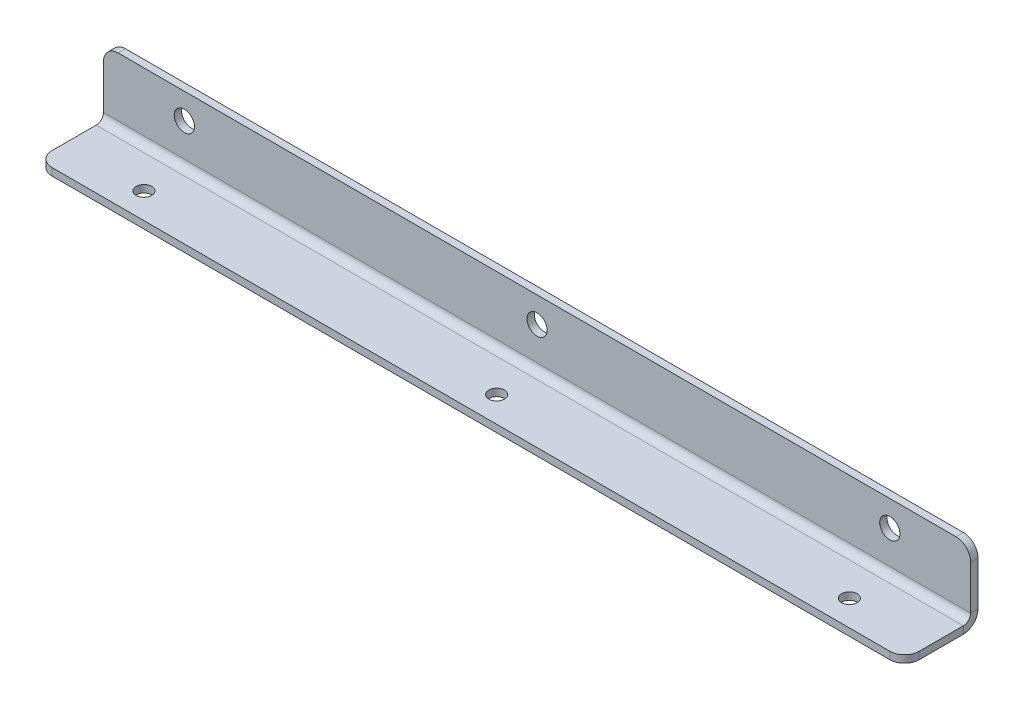
ISO-10303-21;
HEADER;
FILE_DESCRIPTION(('STEP AP214'),'2;1');
FILE_NAME('part.step','',(''),(''),'','','');
FILE_SCHEMA(('AUTOMOTIVE_DESIGN { 1 0 10303 214 1 1 1 1 }'));
ENDSEC;
DATA;
#1=APPLICATION_CONTEXT('core data for automotive mechanical design processes');
#2=APPLICATION_PROTOCOL_DEFINITION('international standard','automotive_design',2000,#1);
#3=PRODUCT_CONTEXT('',#1,'mechanical');
#4=PRODUCT('Part','Part','',(#3));
#5=PRODUCT_RELATED_PRODUCT_CATEGORY('part','',(#4));
#6=PRODUCT_DEFINITION_FORMATION('','',#4);
#7=PRODUCT_DEFINITION_CONTEXT('part definition',#1,'design');
#8=PRODUCT_DEFINITION('design','',#6,#7);
#9=PRODUCT_DEFINITION_SHAPE('','',#8);
#10=(LENGTH_UNIT() NAMED_UNIT(*) SI_UNIT(.MILLI.,.METRE.));
#11=(NAMED_UNIT(*) PLANE_ANGLE_UNIT() SI_UNIT($,.RADIAN.));
#12=(NAMED_UNIT(*) SI_UNIT($,.STERADIAN.) SOLID_ANGLE_UNIT());
#13=UNCERTAINTY_MEASURE_WITH_UNIT(LENGTH_MEASURE(1.E-05),#10,'distance_accuracy_value','');
#14=(GEOMETRIC_REPRESENTATION_CONTEXT(3) GLOBAL_UNCERTAINTY_ASSIGNED_CONTEXT((#13)) GLOBAL_UNIT_ASSIGNED_CONTEXT((#10,
#11,#12)) REPRESENTATION_CONTEXT('',''));
#15=CARTESIAN_POINT('',(0.,0.,0.));
#16=DIRECTION('',(0.,0.,1.));
#17=DIRECTION('',(1.,0.,0.));
#18=AXIS2_PLACEMENT_3D('',#15,#16,#17);
#19=CARTESIAN_POINT('',(374.65,0.,-25.4));
#20=DIRECTION('',(1.,0.,0.));
#21=DIRECTION('',(0.,0.,-1.));
#22=AXIS2_PLACEMENT_3D('',#19,#20,#21);
#23=PLANE('',#22);
#24=DIRECTION('',(0.,1.,0.));
#25=VECTOR('',#24,1.);
#26=CARTESIAN_POINT('',(374.65,0.,-25.4));
#27=LINE('',#26,#25);
#28=CARTESIAN_POINT('',(374.65,0.,-25.4));
#29=VERTEX_POINT('',#28);
#30=CARTESIAN_POINT('',(374.65,3.175,-25.4));
#31=VERTEX_POINT('',#30);
#32=EDGE_CURVE('E137',#29,#31,#27,.T.);
#33=ORIENTED_EDGE('',*,*,#32,.F.);
#34=CARTESIAN_POINT('',(374.65,6.35,-25.4));
#35=DIRECTION('',(-1.,0.,0.));
#36=DIRECTION('',(0.,0.,1.));
#37=AXIS2_PLACEMENT_3D('',#34,#35,#36);
#38=CIRCLE('',#37,6.35);
#39=CARTESIAN_POINT('',(374.65,6.35,-31.75));
#40=VERTEX_POINT('',#39);
#41=EDGE_CURVE('E135',#29,#40,#38,.F.);
#42=ORIENTED_EDGE('',*,*,#41,.T.);
#43=DIRECTION('',(0.,0.,-1.));
#44=VECTOR('',#43,1.);
#45=CARTESIAN_POINT('',(374.65,6.35,-28.575));
#46=LINE('',#45,#44);
#47=CARTESIAN_POINT('',(374.65,6.35,-28.575));
#48=VERTEX_POINT('',#47);
#49=EDGE_CURVE('E129',#48,#40,#46,.T.);
#50=ORIENTED_EDGE('',*,*,#49,.F.);
#51=CARTESIAN_POINT('',(374.65,6.35,-25.4));
#52=DIRECTION('',(1.,0.,0.));
#53=DIRECTION('',(0.,0.,-1.));
#54=AXIS2_PLACEMENT_3D('',#51,#52,#53);
#55=CIRCLE('',#54,3.175);
#56=EDGE_CURVE('E133',#31,#48,#55,.T.);
#57=ORIENTED_EDGE('',*,*,#56,.F.);
#58=EDGE_LOOP('',(#33,#42,#50,#57));
#59=FACE_BOUND('',#58,.T.);
#60=ADVANCED_FACE('F36',(#59),#23,.T.);
#61=CARTESIAN_POINT('',(374.65,6.35,-28.575));
#62=DIRECTION('',(1.,0.,0.));
#63=DIRECTION('',(0.,0.,-1.));
#64=AXIS2_PLACEMENT_3D('',#61,#62,#63);
#65=PLANE('',#64);
#66=DIRECTION('',(0.,0.,-1.));
#67=VECTOR('',#66,1.);
#68=CARTESIAN_POINT('',(374.65,3.175,0.));
#69=LINE('',#68,#67);
#70=CARTESIAN_POINT('',(374.65,3.175,-6.35));
#71=VERTEX_POINT('',#70);
#72=EDGE_CURVE('E158',#71,#31,#69,.T.);
#73=ORIENTED_EDGE('',*,*,#72,.F.);
#74=DIRECTION('',(0.,1.,0.));
#75=VECTOR('',#74,1.);
#76=CARTESIAN_POINT('',(374.65,6.35,-6.35));
#77=LINE('',#76,#75);
#78=CARTESIAN_POINT('',(374.65,0.,-6.35));
#79=VERTEX_POINT('',#78);
#80=EDGE_CURVE('E212',#71,#79,#77,.F.);
#81=ORIENTED_EDGE('',*,*,#80,.T.);
#82=DIRECTION('',(0.,0.,-1.));
#83=VECTOR('',#82,1.);
#84=CARTESIAN_POINT('',(374.65,0.,0.));
#85=LINE('',#84,#83);
#86=EDGE_CURVE('E160',#79,#29,#85,.T.);
#87=ORIENTED_EDGE('',*,*,#86,.T.);
#88=ORIENTED_EDGE('',*,*,#32,.T.);
#89=EDGE_LOOP('',(#73,#81,#87,#88));
#90=FACE_BOUND('',#89,.T.);
#91=ADVANCED_FACE('F256',(#90),#65,.T.);
#92=CARTESIAN_POINT('',(0.,6.35,-31.75));
#93=DIRECTION('',(-1.,0.,0.));
#94=DIRECTION('',(0.,0.,1.));
#95=AXIS2_PLACEMENT_3D('',#92,#93,#94);
#96=PLANE('',#95);
#97=DIRECTION('',(0.,0.,1.));
#98=VECTOR('',#97,1.);
#99=CARTESIAN_POINT('',(0.,6.35,-31.75));
#100=LINE('',#99,#98);
#101=CARTESIAN_POINT('',(0.,6.35,-31.75));
#102=VERTEX_POINT('',#101);
#103=CARTESIAN_POINT('',(0.,6.35,-28.575));
#104=VERTEX_POINT('',#103);
#105=EDGE_CURVE('E138',#102,#104,#100,.T.);
#106=ORIENTED_EDGE('',*,*,#105,.F.);
#107=CARTESIAN_POINT('',(0.,6.35,-25.4));
#108=DIRECTION('',(-1.,0.,0.));
#109=DIRECTION('',(0.,0.,1.));
#110=AXIS2_PLACEMENT_3D('',#107,#108,#109);
#111=CIRCLE('',#110,6.35);
#112=CARTESIAN_POINT('',(0.,0.,-25.4));
#113=VERTEX_POINT('',#112);
#114=EDGE_CURVE('E178',#113,#102,#111,.F.);
#115=ORIENTED_EDGE('',*,*,#114,.F.);
#116=DIRECTION('',(0.,-1.,0.));
#117=VECTOR('',#116,1.);
#118=CARTESIAN_POINT('',(0.,3.175,-25.4));
#119=LINE('',#118,#117);
#120=CARTESIAN_POINT('',(0.,3.175,-25.4));
#121=VERTEX_POINT('',#120);
#122=EDGE_CURVE('E197',#121,#113,#119,.T.);
#123=ORIENTED_EDGE('',*,*,#122,.F.);
#124=CARTESIAN_POINT('',(0.,6.35,-25.4));
#125=DIRECTION('',(1.,0.,0.));
#126=DIRECTION('',(0.,0.,-1.));
#127=AXIS2_PLACEMENT_3D('',#124,#125,#126);
#128=CIRCLE('',#127,3.175);
#129=EDGE_CURVE('E172',#121,#104,#128,.T.);
#130=ORIENTED_EDGE('',*,*,#129,.T.);
#131=EDGE_LOOP('',(#106,#115,#123,#130));
#132=FACE_BOUND('',#131,.T.);
#133=ADVANCED_FACE('F246',(#132),#96,.T.);
#134=CARTESIAN_POINT('',(0.,3.175,-25.4));
#135=DIRECTION('',(-1.,0.,0.));
#136=DIRECTION('',(0.,0.,1.));
#137=AXIS2_PLACEMENT_3D('',#134,#135,#136);
#138=PLANE('',#137);
#139=DIRECTION('',(0.,1.,0.));
#140=VECTOR('',#139,1.);
#141=CARTESIAN_POINT('',(0.,0.,-28.575));
#142=LINE('',#141,#140);
#143=CARTESIAN_POINT('',(0.,25.4,-28.575));
#144=VERTEX_POINT('',#143);
#145=EDGE_CURVE('E145',#104,#144,#142,.T.);
#146=ORIENTED_EDGE('',*,*,#145,.T.);
#147=DIRECTION('',(0.,0.,-1.));
#148=VECTOR('',#147,1.);
#149=CARTESIAN_POINT('',(0.,25.4,-25.4));
#150=LINE('',#149,#148);
#151=CARTESIAN_POINT('',(0.,25.4,-31.75));
#152=VERTEX_POINT('',#151);
#153=EDGE_CURVE('E44',#144,#152,#150,.T.);
#154=ORIENTED_EDGE('',*,*,#153,.T.);
#155=DIRECTION('',(0.,1.,0.));
#156=VECTOR('',#155,1.);
#157=CARTESIAN_POINT('',(0.,0.,-31.75));
#158=LINE('',#157,#156);
#159=EDGE_CURVE('E167',#102,#152,#158,.T.);
#160=ORIENTED_EDGE('',*,*,#159,.F.);
#161=ORIENTED_EDGE('',*,*,#105,.T.);
#162=EDGE_LOOP('',(#146,#154,#160,#161));
#163=FACE_BOUND('',#162,.T.);
#164=ADVANCED_FACE('F234',(#163),#138,.T.);
#165=CARTESIAN_POINT('',(374.65,0.,-31.75));
#166=DIRECTION('',(0.,0.,1.));
#167=DIRECTION('',(1.,0.,0.));
#168=AXIS2_PLACEMENT_3D('',#165,#166,#167);
#169=PLANE('',#168);
#170=CARTESIAN_POINT('',(34.925,20.6375,-31.75));
#171=DIRECTION('',(0.,0.,1.));
#172=DIRECTION('',(-1.,0.,0.));
#173=AXIS2_PLACEMENT_3D('',#170,#171,#172);
#174=CIRCLE('',#173,4.3688);
#175=CARTESIAN_POINT('',(30.5562,20.6375,-31.75));
#176=VERTEX_POINT('',#175);
#177=EDGE_CURVE('E351',#176,#176,#174,.T.);
#178=ORIENTED_EDGE('',*,*,#177,.T.);
#179=EDGE_LOOP('',(#178));
#180=FACE_BOUND('',#179,.T.);
#181=CARTESIAN_POINT('',(339.725,20.6375,-31.75));
#182=DIRECTION('',(0.,0.,1.));
#183=DIRECTION('',(1.,0.,0.));
#184=AXIS2_PLACEMENT_3D('',#181,#182,#183);
#185=CIRCLE('',#184,4.36879999999999);
#186=CARTESIAN_POINT('',(344.0938,20.6375,-31.75));
#187=VERTEX_POINT('',#186);
#188=EDGE_CURVE('E346',#187,#187,#185,.T.);
#189=ORIENTED_EDGE('',*,*,#188,.T.);
#190=EDGE_LOOP('',(#189));
#191=FACE_BOUND('',#190,.T.);
#192=CARTESIAN_POINT('',(187.325,20.6375,-31.75));
#193=DIRECTION('',(0.,0.,1.));
#194=DIRECTION('',(1.,0.,0.));
#195=AXIS2_PLACEMENT_3D('',#192,#193,#194);
#196=CIRCLE('',#195,4.36879999999999);
#197=CARTESIAN_POINT('',(191.6938,20.6375,-31.75));
#198=VERTEX_POINT('',#197);
#199=EDGE_CURVE('E361',#198,#198,#196,.T.);
#200=ORIENTED_EDGE('',*,*,#199,.T.);
#201=EDGE_LOOP('',(#200));
#202=FACE_BOUND('',#201,.T.);
#203=DIRECTION('',(-1.,0.,0.));
#204=VECTOR('',#203,1.);
#205=CARTESIAN_POINT('',(374.65,31.75,-31.75));
#206=LINE('',#205,#204);
#207=CARTESIAN_POINT('',(368.3,31.75,-31.75));
#208=VERTEX_POINT('',#207);
#209=CARTESIAN_POINT('',(6.35000000000013,31.75,-31.75));
#210=VERTEX_POINT('',#209);
#211=EDGE_CURVE('E194',#208,#210,#206,.T.);
#212=ORIENTED_EDGE('',*,*,#211,.F.);
#213=CARTESIAN_POINT('',(368.3,25.4,-31.75));
#214=DIRECTION('',(0.,0.,1.));
#215=DIRECTION('',(1.,0.,0.));
#216=AXIS2_PLACEMENT_3D('',#213,#214,#215);
#217=CIRCLE('',#216,6.35);
#218=CARTESIAN_POINT('',(374.65,25.4,-31.75));
#219=VERTEX_POINT('',#218);
#220=EDGE_CURVE('E225',#208,#219,#217,.F.);
#221=ORIENTED_EDGE('',*,*,#220,.T.);
#222=DIRECTION('',(0.,1.,0.));
#223=VECTOR('',#222,1.);
#224=CARTESIAN_POINT('',(374.65,0.,-31.75));
#225=LINE('',#224,#223);
#226=EDGE_CURVE('E153',#40,#219,#225,.T.);
#227=ORIENTED_EDGE('',*,*,#226,.F.);
#228=DIRECTION('',(-1.,0.,0.));
#229=VECTOR('',#228,1.);
#230=CARTESIAN_POINT('',(374.65,6.35,-31.75));
#231=LINE('',#230,#229);
#232=EDGE_CURVE('E166',#40,#102,#231,.T.);
#233=ORIENTED_EDGE('',*,*,#232,.T.);
#234=ORIENTED_EDGE('',*,*,#159,.T.);
#235=CARTESIAN_POINT('',(6.35,25.4,-31.75));
#236=DIRECTION('',(0.,0.,1.));
#237=DIRECTION('',(1.,0.,0.));
#238=AXIS2_PLACEMENT_3D('',#235,#236,#237);
#239=CIRCLE('',#238,6.35);
#240=EDGE_CURVE('E223',#152,#210,#239,.F.);
#241=ORIENTED_EDGE('',*,*,#240,.T.);
#242=EDGE_LOOP('',(#212,#221,#227,#233,#234,#241));
#243=FACE_BOUND('',#242,.T.);
#244=ADVANCED_FACE('F238',(#180,#191,#202,#243),#169,.F.);
#245=CARTESIAN_POINT('',(374.65,31.75,-28.575));
#246=DIRECTION('',(0.,1.,0.));
#247=DIRECTION('',(0.,0.,1.));
#248=AXIS2_PLACEMENT_3D('',#245,#246,#247);
#249=PLANE('',#248);
#250=DIRECTION('',(-1.,0.,0.));
#251=VECTOR('',#250,1.);
#252=CARTESIAN_POINT('',(374.65,31.75,-28.575));
#253=LINE('',#252,#251);
#254=CARTESIAN_POINT('',(368.3,31.75,-28.575));
#255=VERTEX_POINT('',#254);
#256=CARTESIAN_POINT('',(6.35000000000013,31.75,-28.575));
#257=VERTEX_POINT('',#256);
#258=EDGE_CURVE('E149',#255,#257,#253,.T.);
#259=ORIENTED_EDGE('',*,*,#258,.F.);
#260=DIRECTION('',(0.,0.,-1.));
#261=VECTOR('',#260,1.);
#262=CARTESIAN_POINT('',(368.3,31.75,-28.575));
#263=LINE('',#262,#261);
#264=EDGE_CURVE('E220',#255,#208,#263,.T.);
#265=ORIENTED_EDGE('',*,*,#264,.T.);
#266=ORIENTED_EDGE('',*,*,#211,.T.);
#267=DIRECTION('',(0.,0.,-1.));
#268=VECTOR('',#267,1.);
#269=CARTESIAN_POINT('',(6.35000000000002,31.75,-28.575));
#270=LINE('',#269,#268);
#271=EDGE_CURVE('E218',#210,#257,#270,.F.);
#272=ORIENTED_EDGE('',*,*,#271,.T.);
#273=EDGE_LOOP('',(#259,#265,#266,#272));
#274=FACE_BOUND('',#273,.T.);
#275=ADVANCED_FACE('F299',(#274),#249,.T.);
#276=CARTESIAN_POINT('',(374.65,0.,-28.575));
#277=DIRECTION('',(0.,0.,1.));
#278=DIRECTION('',(1.,0.,0.));
#279=AXIS2_PLACEMENT_3D('',#276,#277,#278);
#280=PLANE('',#279);
#281=CARTESIAN_POINT('',(34.925,20.6375,-28.575));
#282=DIRECTION('',(0.,0.,1.));
#283=DIRECTION('',(-1.,0.,0.));
#284=AXIS2_PLACEMENT_3D('',#281,#282,#283);
#285=CIRCLE('',#284,4.3688);
#286=CARTESIAN_POINT('',(30.5562,20.6375,-28.575));
#287=VERTEX_POINT('',#286);
#288=EDGE_CURVE('E356',#287,#287,#285,.T.);
#289=ORIENTED_EDGE('',*,*,#288,.F.);
#290=EDGE_LOOP('',(#289));
#291=FACE_BOUND('',#290,.T.);
#292=CARTESIAN_POINT('',(339.725,20.6375,-28.575));
#293=DIRECTION('',(0.,0.,1.));
#294=DIRECTION('',(1.,0.,0.));
#295=AXIS2_PLACEMENT_3D('',#292,#293,#294);
#296=CIRCLE('',#295,4.36879999999999);
#297=CARTESIAN_POINT('',(344.0938,20.6375,-28.575));
#298=VERTEX_POINT('',#297);
#299=EDGE_CURVE('E349',#298,#298,#296,.T.);
#300=ORIENTED_EDGE('',*,*,#299,.F.);
#301=EDGE_LOOP('',(#300));
#302=FACE_BOUND('',#301,.T.);
#303=CARTESIAN_POINT('',(187.325,20.6375,-28.575));
#304=DIRECTION('',(0.,0.,1.));
#305=DIRECTION('',(1.,0.,0.));
#306=AXIS2_PLACEMENT_3D('',#303,#304,#305);
#307=CIRCLE('',#306,4.36879999999999);
#308=CARTESIAN_POINT('',(191.6938,20.6375,-28.575));
#309=VERTEX_POINT('',#308);
#310=EDGE_CURVE('E353',#309,#309,#307,.T.);
#311=ORIENTED_EDGE('',*,*,#310,.F.);
#312=EDGE_LOOP('',(#311));
#313=FACE_BOUND('',#312,.T.);
#314=DIRECTION('',(0.,1.,0.));
#315=VECTOR('',#314,1.);
#316=CARTESIAN_POINT('',(374.65,0.,-28.575));
#317=LINE('',#316,#315);
#318=CARTESIAN_POINT('',(374.65,25.4,-28.575));
#319=VERTEX_POINT('',#318);
#320=EDGE_CURVE('E143',#48,#319,#317,.T.);
#321=ORIENTED_EDGE('',*,*,#320,.T.);
#322=CARTESIAN_POINT('',(368.3,25.4,-28.575));
#323=DIRECTION('',(0.,0.,1.));
#324=DIRECTION('',(1.,0.,0.));
#325=AXIS2_PLACEMENT_3D('',#322,#323,#324);
#326=CIRCLE('',#325,6.35);
#327=EDGE_CURVE('E229',#319,#255,#326,.T.);
#328=ORIENTED_EDGE('',*,*,#327,.T.);
#329=ORIENTED_EDGE('',*,*,#258,.T.);
#330=CARTESIAN_POINT('',(6.35,25.4,-28.575));
#331=DIRECTION('',(0.,0.,1.));
#332=DIRECTION('',(1.,0.,0.));
#333=AXIS2_PLACEMENT_3D('',#330,#331,#332);
#334=CIRCLE('',#333,6.35);
#335=EDGE_CURVE('E51',#257,#144,#334,.T.);
#336=ORIENTED_EDGE('',*,*,#335,.T.);
#337=ORIENTED_EDGE('',*,*,#145,.F.);
#338=DIRECTION('',(-1.,0.,0.));
#339=VECTOR('',#338,1.);
#340=CARTESIAN_POINT('',(374.65,6.35,-28.575));
#341=LINE('',#340,#339);
#342=EDGE_CURVE('E141',#48,#104,#341,.T.);
#343=ORIENTED_EDGE('',*,*,#342,.F.);
#344=EDGE_LOOP('',(#321,#328,#329,#336,#337,#343));
#345=FACE_BOUND('',#344,.T.);
#346=ADVANCED_FACE('F142',(#291,#302,#313,#345),#280,.T.);
#347=CARTESIAN_POINT('',(374.65,6.35,-25.4));
#348=DIRECTION('',(-1.,0.,0.));
#349=DIRECTION('',(0.,0.,1.));
#350=AXIS2_PLACEMENT_3D('',#347,#348,#349);
#351=CYLINDRICAL_SURFACE('',#350,3.175);
#352=ORIENTED_EDGE('',*,*,#129,.F.);
#353=DIRECTION('',(-1.,0.,0.));
#354=VECTOR('',#353,1.);
#355=CARTESIAN_POINT('',(374.65,3.175,-25.4));
#356=LINE('',#355,#354);
#357=EDGE_CURVE('E150',#31,#121,#356,.T.);
#358=ORIENTED_EDGE('',*,*,#357,.F.);
#359=ORIENTED_EDGE('',*,*,#56,.T.);
#360=ORIENTED_EDGE('',*,*,#342,.T.);
#361=EDGE_LOOP('',(#352,#358,#359,#360));
#362=FACE_BOUND('',#361,.T.);
#363=ADVANCED_FACE('F156',(#362),#351,.F.);
#364=CARTESIAN_POINT('',(374.65,3.175,0.));
#365=DIRECTION('',(0.,1.,0.));
#366=DIRECTION('',(0.,0.,1.));
#367=AXIS2_PLACEMENT_3D('',#364,#365,#366);
#368=PLANE('',#367);
#369=CARTESIAN_POINT('',(34.925,3.175,-11.1125));
#370=DIRECTION('',(0.,1.,0.));
#371=DIRECTION('',(0.,0.,-1.));
#372=AXIS2_PLACEMENT_3D('',#369,#370,#371);
#373=CIRCLE('',#372,3.37819999999999);
#374=CARTESIAN_POINT('',(34.925,3.175,-14.4907));
#375=VERTEX_POINT('',#374);
#376=EDGE_CURVE('E364',#375,#375,#373,.T.);
#377=ORIENTED_EDGE('',*,*,#376,.F.);
#378=EDGE_LOOP('',(#377));
#379=FACE_BOUND('',#378,.T.);
#380=CARTESIAN_POINT('',(339.725,3.175,-11.1125));
#381=DIRECTION('',(0.,1.,0.));
#382=DIRECTION('',(0.,0.,1.));
#383=AXIS2_PLACEMENT_3D('',#380,#381,#382);
#384=CIRCLE('',#383,3.37819999999999);
#385=CARTESIAN_POINT('',(339.725,3.175,-7.73429999999997));
#386=VERTEX_POINT('',#385);
#387=EDGE_CURVE('E371',#386,#386,#384,.T.);
#388=ORIENTED_EDGE('',*,*,#387,.F.);
#389=EDGE_LOOP('',(#388));
#390=FACE_BOUND('',#389,.T.);
#391=CARTESIAN_POINT('',(187.325,3.175,-11.1125));
#392=DIRECTION('',(0.,1.,0.));
#393=DIRECTION('',(0.,0.,1.));
#394=AXIS2_PLACEMENT_3D('',#391,#392,#393);
#395=CIRCLE('',#394,3.37819999999999);
#396=CARTESIAN_POINT('',(187.325,3.175,-7.73429999999997));
#397=VERTEX_POINT('',#396);
#398=EDGE_CURVE('E370',#397,#397,#395,.T.);
#399=ORIENTED_EDGE('',*,*,#398,.F.);
#400=EDGE_LOOP('',(#399));
#401=FACE_BOUND('',#400,.T.);
#402=DIRECTION('',(-1.,0.,0.));
#403=VECTOR('',#402,1.);
#404=CARTESIAN_POINT('',(374.65,3.175,0.));
#405=LINE('',#404,#403);
#406=CARTESIAN_POINT('',(368.3,3.175,0.));
#407=VERTEX_POINT('',#406);
#408=CARTESIAN_POINT('',(6.35000000000013,3.175,0.));
#409=VERTEX_POINT('',#408);
#410=EDGE_CURVE('E189',#407,#409,#405,.T.);
#411=ORIENTED_EDGE('',*,*,#410,.F.);
#412=CARTESIAN_POINT('',(368.3,3.175,-6.35));
#413=DIRECTION('',(0.,1.,0.));
#414=DIRECTION('',(0.,0.,1.));
#415=AXIS2_PLACEMENT_3D('',#412,#413,#414);
#416=CIRCLE('',#415,6.35);
#417=EDGE_CURVE('E210',#407,#71,#416,.T.);
#418=ORIENTED_EDGE('',*,*,#417,.T.);
#419=ORIENTED_EDGE('',*,*,#72,.T.);
#420=ORIENTED_EDGE('',*,*,#357,.T.);
#421=DIRECTION('',(0.,0.,-1.));
#422=VECTOR('',#421,1.);
#423=CARTESIAN_POINT('',(0.,3.175,0.));
#424=LINE('',#423,#422);
#425=CARTESIAN_POINT('',(0.,3.175,-6.35));
#426=VERTEX_POINT('',#425);
#427=EDGE_CURVE('E174',#426,#121,#424,.T.);
#428=ORIENTED_EDGE('',*,*,#427,.F.);
#429=CARTESIAN_POINT('',(6.35,3.175,-6.35));
#430=DIRECTION('',(0.,1.,0.));
#431=DIRECTION('',(0.,0.,1.));
#432=AXIS2_PLACEMENT_3D('',#429,#430,#431);
#433=CIRCLE('',#432,6.35);
#434=EDGE_CURVE('E208',#426,#409,#433,.T.);
#435=ORIENTED_EDGE('',*,*,#434,.T.);
#436=EDGE_LOOP('',(#411,#418,#419,#420,#428,#435));
#437=FACE_BOUND('',#436,.T.);
#438=ADVANCED_FACE('F252',(#379,#390,#401,#437),#368,.T.);
#439=CARTESIAN_POINT('',(374.65,0.,0.));
#440=DIRECTION('',(0.,0.,1.));
#441=DIRECTION('',(1.,0.,0.));
#442=AXIS2_PLACEMENT_3D('',#439,#440,#441);
#443=PLANE('',#442);
#444=DIRECTION('',(-1.,0.,0.));
#445=VECTOR('',#444,1.);
#446=CARTESIAN_POINT('',(374.65,0.,0.));
#447=LINE('',#446,#445);
#448=CARTESIAN_POINT('',(368.3,0.,0.));
#449=VERTEX_POINT('',#448);
#450=CARTESIAN_POINT('',(6.35000000000013,0.,0.));
#451=VERTEX_POINT('',#450);
#452=EDGE_CURVE('E186',#449,#451,#447,.T.);
#453=ORIENTED_EDGE('',*,*,#452,.F.);
#454=DIRECTION('',(0.,1.,0.));
#455=VECTOR('',#454,1.);
#456=CARTESIAN_POINT('',(368.3,0.,0.));
#457=LINE('',#456,#455);
#458=EDGE_CURVE('E205',#449,#407,#457,.T.);
#459=ORIENTED_EDGE('',*,*,#458,.T.);
#460=ORIENTED_EDGE('',*,*,#410,.T.);
#461=DIRECTION('',(0.,1.,0.));
#462=VECTOR('',#461,1.);
#463=CARTESIAN_POINT('',(6.35,0.,0.));
#464=LINE('',#463,#462);
#465=EDGE_CURVE('E203',#409,#451,#464,.F.);
#466=ORIENTED_EDGE('',*,*,#465,.T.);
#467=EDGE_LOOP('',(#453,#459,#460,#466));
#468=FACE_BOUND('',#467,.T.);
#469=ADVANCED_FACE('F268',(#468),#443,.T.);
#470=CARTESIAN_POINT('',(374.65,0.,0.));
#471=DIRECTION('',(0.,1.,0.));
#472=DIRECTION('',(0.,0.,1.));
#473=AXIS2_PLACEMENT_3D('',#470,#471,#472);
#474=PLANE('',#473);
#475=CARTESIAN_POINT('',(34.925,0.,-11.1125));
#476=DIRECTION('',(0.,1.,0.));
#477=DIRECTION('',(0.,0.,-1.));
#478=AXIS2_PLACEMENT_3D('',#475,#476,#477);
#479=CIRCLE('',#478,3.37819999999999);
#480=CARTESIAN_POINT('',(34.925,0.,-14.4907));
#481=VERTEX_POINT('',#480);
#482=EDGE_CURVE('E374',#481,#481,#479,.T.);
#483=ORIENTED_EDGE('',*,*,#482,.T.);
#484=EDGE_LOOP('',(#483));
#485=FACE_BOUND('',#484,.T.);
#486=CARTESIAN_POINT('',(339.725,0.,-11.1125));
#487=DIRECTION('',(0.,1.,0.));
#488=DIRECTION('',(0.,0.,1.));
#489=AXIS2_PLACEMENT_3D('',#486,#487,#488);
#490=CIRCLE('',#489,3.37819999999999);
#491=CARTESIAN_POINT('',(339.725,0.,-7.73429999999997));
#492=VERTEX_POINT('',#491);
#493=EDGE_CURVE('E367',#492,#492,#490,.T.);
#494=ORIENTED_EDGE('',*,*,#493,.T.);
#495=EDGE_LOOP('',(#494));
#496=FACE_BOUND('',#495,.T.);
#497=CARTESIAN_POINT('',(187.325,0.,-11.1125));
#498=DIRECTION('',(0.,1.,0.));
#499=DIRECTION('',(0.,0.,1.));
#500=AXIS2_PLACEMENT_3D('',#497,#498,#499);
#501=CIRCLE('',#500,3.37819999999999);
#502=CARTESIAN_POINT('',(187.325,0.,-7.73429999999997));
#503=VERTEX_POINT('',#502);
#504=EDGE_CURVE('E170',#503,#503,#501,.T.);
#505=ORIENTED_EDGE('',*,*,#504,.T.);
#506=EDGE_LOOP('',(#505));
#507=FACE_BOUND('',#506,.T.);
#508=ORIENTED_EDGE('',*,*,#86,.F.);
#509=CARTESIAN_POINT('',(368.3,0.,-6.35));
#510=DIRECTION('',(0.,1.,0.));
#511=DIRECTION('',(0.,0.,1.));
#512=AXIS2_PLACEMENT_3D('',#509,#510,#511);
#513=CIRCLE('',#512,6.35);
#514=EDGE_CURVE('E216',#79,#449,#513,.F.);
#515=ORIENTED_EDGE('',*,*,#514,.T.);
#516=ORIENTED_EDGE('',*,*,#452,.T.);
#517=CARTESIAN_POINT('',(6.35,0.,-6.35));
#518=DIRECTION('',(0.,1.,0.));
#519=DIRECTION('',(0.,0.,1.));
#520=AXIS2_PLACEMENT_3D('',#517,#518,#519);
#521=CIRCLE('',#520,6.35);
#522=CARTESIAN_POINT('',(0.,0.,-6.35));
#523=VERTEX_POINT('',#522);
#524=EDGE_CURVE('E214',#451,#523,#521,.F.);
#525=ORIENTED_EDGE('',*,*,#524,.T.);
#526=DIRECTION('',(0.,0.,-1.));
#527=VECTOR('',#526,1.);
#528=CARTESIAN_POINT('',(0.,0.,0.));
#529=LINE('',#528,#527);
#530=EDGE_CURVE('E176',#523,#113,#529,.T.);
#531=ORIENTED_EDGE('',*,*,#530,.T.);
#532=DIRECTION('',(-1.,0.,0.));
#533=VECTOR('',#532,1.);
#534=CARTESIAN_POINT('',(374.65,0.,-25.4));
#535=LINE('',#534,#533);
#536=EDGE_CURVE('E183',#29,#113,#535,.T.);
#537=ORIENTED_EDGE('',*,*,#536,.F.);
#538=EDGE_LOOP('',(#508,#515,#516,#525,#531,#537));
#539=FACE_BOUND('',#538,.T.);
#540=ADVANCED_FACE('F259',(#485,#496,#507,#539),#474,.F.);
#541=CARTESIAN_POINT('',(374.65,6.35,-25.4));
#542=DIRECTION('',(-1.,0.,0.));
#543=DIRECTION('',(0.,0.,1.));
#544=AXIS2_PLACEMENT_3D('',#541,#542,#543);
#545=CYLINDRICAL_SURFACE('',#544,6.35);
#546=ORIENTED_EDGE('',*,*,#114,.T.);
#547=ORIENTED_EDGE('',*,*,#232,.F.);
#548=ORIENTED_EDGE('',*,*,#41,.F.);
#549=ORIENTED_EDGE('',*,*,#536,.T.);
#550=EDGE_LOOP('',(#546,#547,#548,#549));
#551=FACE_BOUND('',#550,.T.);
#552=ADVANCED_FACE('F241',(#551),#545,.T.);
#553=CARTESIAN_POINT('',(374.65,6.35,-25.4));
#554=DIRECTION('',(1.,0.,0.));
#555=DIRECTION('',(0.,0.,-1.));
#556=AXIS2_PLACEMENT_3D('',#553,#554,#555);
#557=PLANE('',#556);
#558=ORIENTED_EDGE('',*,*,#226,.T.);
#559=DIRECTION('',(0.,0.,-1.));
#560=VECTOR('',#559,1.);
#561=CARTESIAN_POINT('',(374.65,25.4,-25.4));
#562=LINE('',#561,#560);
#563=EDGE_CURVE('E59',#219,#319,#562,.F.);
#564=ORIENTED_EDGE('',*,*,#563,.T.);
#565=ORIENTED_EDGE('',*,*,#320,.F.);
#566=ORIENTED_EDGE('',*,*,#49,.T.);
#567=EDGE_LOOP('',(#558,#564,#565,#566));
#568=FACE_BOUND('',#567,.T.);
#569=ADVANCED_FACE('F152',(#568),#557,.T.);
#570=CARTESIAN_POINT('',(0.,6.35,-25.4));
#571=DIRECTION('',(1.,0.,0.));
#572=DIRECTION('',(0.,0.,-1.));
#573=AXIS2_PLACEMENT_3D('',#570,#571,#572);
#574=PLANE('',#573);
#575=ORIENTED_EDGE('',*,*,#530,.F.);
#576=DIRECTION('',(0.,1.,0.));
#577=VECTOR('',#576,1.);
#578=CARTESIAN_POINT('',(0.,3.175,-6.35));
#579=LINE('',#578,#577);
#580=EDGE_CURVE('E11',#523,#426,#579,.T.);
#581=ORIENTED_EDGE('',*,*,#580,.T.);
#582=ORIENTED_EDGE('',*,*,#427,.T.);
#583=ORIENTED_EDGE('',*,*,#122,.T.);
#584=EDGE_LOOP('',(#575,#581,#582,#583));
#585=FACE_BOUND('',#584,.T.);
#586=ADVANCED_FACE('F263',(#585),#574,.F.);
#587=CARTESIAN_POINT('',(187.325,0.,-11.1125));
#588=DIRECTION('',(0.,1.,0.));
#589=DIRECTION('',(0.,0.,1.));
#590=AXIS2_PLACEMENT_3D('',#587,#588,#589);
#591=CYLINDRICAL_SURFACE('',#590,3.37819999999999);
#592=ORIENTED_EDGE('',*,*,#504,.F.);
#593=EDGE_LOOP('',(#592));
#594=FACE_BOUND('',#593,.T.);
#595=ORIENTED_EDGE('',*,*,#398,.T.);
#596=EDGE_LOOP('',(#595));
#597=FACE_BOUND('',#596,.T.);
#598=ADVANCED_FACE('F321',(#594,#597),#591,.F.);
#599=CARTESIAN_POINT('',(339.725,0.,-11.1125));
#600=DIRECTION('',(0.,1.,0.));
#601=DIRECTION('',(0.,0.,1.));
#602=AXIS2_PLACEMENT_3D('',#599,#600,#601);
#603=CYLINDRICAL_SURFACE('',#602,3.37819999999999);
#604=ORIENTED_EDGE('',*,*,#493,.F.);
#605=EDGE_LOOP('',(#604));
#606=FACE_BOUND('',#605,.T.);
#607=ORIENTED_EDGE('',*,*,#387,.T.);
#608=EDGE_LOOP('',(#607));
#609=FACE_BOUND('',#608,.T.);
#610=ADVANCED_FACE('F326',(#606,#609),#603,.F.);
#611=CARTESIAN_POINT('',(34.925,0.,-11.1125));
#612=DIRECTION('',(0.,1.,0.));
#613=DIRECTION('',(0.,0.,1.));
#614=AXIS2_PLACEMENT_3D('',#611,#612,#613);
#615=CYLINDRICAL_SURFACE('',#614,3.37819999999999);
#616=ORIENTED_EDGE('',*,*,#482,.F.);
#617=EDGE_LOOP('',(#616));
#618=FACE_BOUND('',#617,.T.);
#619=ORIENTED_EDGE('',*,*,#376,.T.);
#620=EDGE_LOOP('',(#619));
#621=FACE_BOUND('',#620,.T.);
#622=ADVANCED_FACE('F328',(#618,#621),#615,.F.);
#623=CARTESIAN_POINT('',(187.325,20.6375,-31.75));
#624=DIRECTION('',(0.,0.,1.));
#625=DIRECTION('',(1.,0.,0.));
#626=AXIS2_PLACEMENT_3D('',#623,#624,#625);
#627=CYLINDRICAL_SURFACE('',#626,4.36879999999999);
#628=ORIENTED_EDGE('',*,*,#199,.F.);
#629=EDGE_LOOP('',(#628));
#630=FACE_BOUND('',#629,.T.);
#631=ORIENTED_EDGE('',*,*,#310,.T.);
#632=EDGE_LOOP('',(#631));
#633=FACE_BOUND('',#632,.T.);
#634=ADVANCED_FACE('F331',(#630,#633),#627,.F.);
#635=CARTESIAN_POINT('',(339.725,20.6375,-31.75));
#636=DIRECTION('',(0.,0.,1.));
#637=DIRECTION('',(1.,0.,0.));
#638=AXIS2_PLACEMENT_3D('',#635,#636,#637);
#639=CYLINDRICAL_SURFACE('',#638,4.36879999999999);
#640=ORIENTED_EDGE('',*,*,#188,.F.);
#641=EDGE_LOOP('',(#640));
#642=FACE_BOUND('',#641,.T.);
#643=ORIENTED_EDGE('',*,*,#299,.T.);
#644=EDGE_LOOP('',(#643));
#645=FACE_BOUND('',#644,.T.);
#646=ADVANCED_FACE('F283',(#642,#645),#639,.F.);
#647=CARTESIAN_POINT('',(34.925,20.6375,-31.75));
#648=DIRECTION('',(0.,0.,1.));
#649=DIRECTION('',(1.,0.,0.));
#650=AXIS2_PLACEMENT_3D('',#647,#648,#649);
#651=CYLINDRICAL_SURFACE('',#650,4.3688);
#652=ORIENTED_EDGE('',*,*,#177,.F.);
#653=EDGE_LOOP('',(#652));
#654=FACE_BOUND('',#653,.T.);
#655=ORIENTED_EDGE('',*,*,#288,.T.);
#656=EDGE_LOOP('',(#655));
#657=FACE_BOUND('',#656,.T.);
#658=ADVANCED_FACE('F274',(#654,#657),#651,.F.);
#659=CARTESIAN_POINT('',(368.3,0.,-6.35));
#660=DIRECTION('',(0.,1.,0.));
#661=DIRECTION('',(0.,0.,1.));
#662=AXIS2_PLACEMENT_3D('',#659,#660,#661);
#663=CYLINDRICAL_SURFACE('',#662,6.35);
#664=ORIENTED_EDGE('',*,*,#514,.F.);
#665=ORIENTED_EDGE('',*,*,#80,.F.);
#666=ORIENTED_EDGE('',*,*,#417,.F.);
#667=ORIENTED_EDGE('',*,*,#458,.F.);
#668=EDGE_LOOP('',(#664,#665,#666,#667));
#669=FACE_BOUND('',#668,.T.);
#670=ADVANCED_FACE('F271',(#669),#663,.T.);
#671=CARTESIAN_POINT('',(368.3,25.4,-28.575));
#672=DIRECTION('',(0.,0.,-1.));
#673=DIRECTION('',(-1.,0.,0.));
#674=AXIS2_PLACEMENT_3D('',#671,#672,#673);
#675=CYLINDRICAL_SURFACE('',#674,6.35);
#676=ORIENTED_EDGE('',*,*,#327,.F.);
#677=ORIENTED_EDGE('',*,*,#563,.F.);
#678=ORIENTED_EDGE('',*,*,#220,.F.);
#679=ORIENTED_EDGE('',*,*,#264,.F.);
#680=EDGE_LOOP('',(#676,#677,#678,#679));
#681=FACE_BOUND('',#680,.T.);
#682=ADVANCED_FACE('F273',(#681),#675,.T.);
#683=CARTESIAN_POINT('',(6.35,25.4,-25.4));
#684=DIRECTION('',(0.,0.,-1.));
#685=DIRECTION('',(-1.,0.,0.));
#686=AXIS2_PLACEMENT_3D('',#683,#684,#685);
#687=CYLINDRICAL_SURFACE('',#686,6.35);
#688=ORIENTED_EDGE('',*,*,#335,.F.);
#689=ORIENTED_EDGE('',*,*,#271,.F.);
#690=ORIENTED_EDGE('',*,*,#240,.F.);
#691=ORIENTED_EDGE('',*,*,#153,.F.);
#692=EDGE_LOOP('',(#688,#689,#690,#691));
#693=FACE_BOUND('',#692,.T.);
#694=ADVANCED_FACE('F280',(#693),#687,.T.);
#695=CARTESIAN_POINT('',(6.35,6.35,-6.35));
#696=DIRECTION('',(0.,-1.,0.));
#697=DIRECTION('',(0.,0.,-1.));
#698=AXIS2_PLACEMENT_3D('',#695,#696,#697);
#699=CYLINDRICAL_SURFACE('',#698,6.35);
#700=ORIENTED_EDGE('',*,*,#524,.F.);
#701=ORIENTED_EDGE('',*,*,#465,.F.);
#702=ORIENTED_EDGE('',*,*,#434,.F.);
#703=ORIENTED_EDGE('',*,*,#580,.F.);
#704=EDGE_LOOP('',(#700,#701,#702,#703));
#705=FACE_BOUND('',#704,.T.);
#706=ADVANCED_FACE('F38',(#705),#699,.T.);
#707=CLOSED_SHELL('',(#60,#91,#133,#164,#244,#275,#346,#363,#438,#469,#540,#552,#569,#586,#598,
#610,#622,#634,#646,#658,#670,#682,#694,#706));
#708=MANIFOLD_SOLID_BREP('B2',#707);
#709=ADVANCED_BREP_SHAPE_REPRESENTATION('',(#18,#708),#14);
#710=SHAPE_DEFINITION_REPRESENTATION(#9,#709);
ENDSEC;
END-ISO-10303-21;
